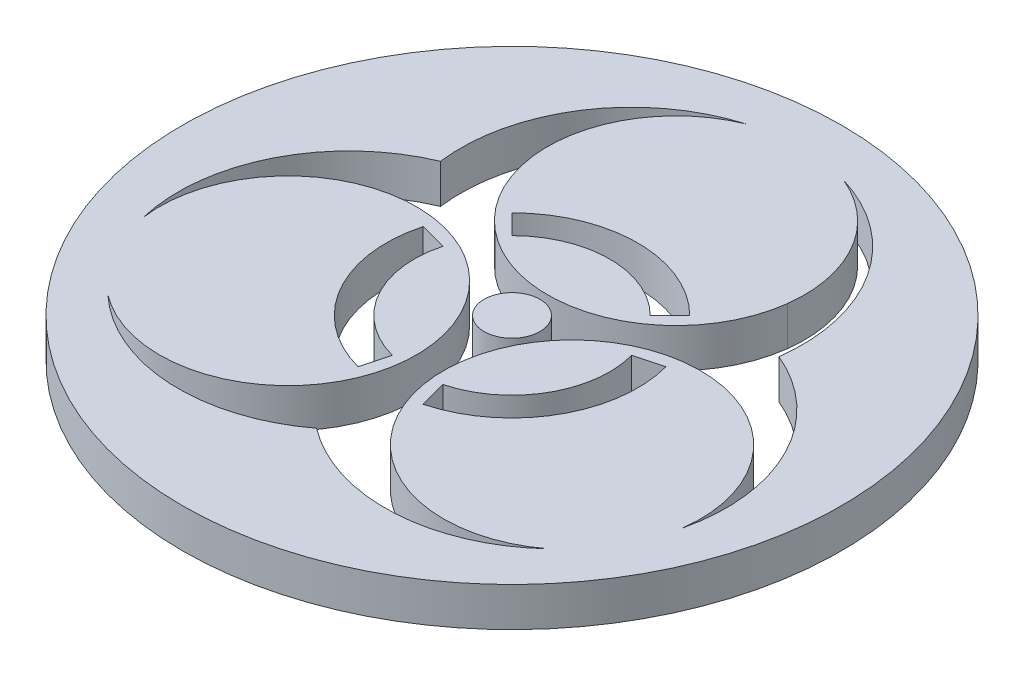
ISO-10303-21;
HEADER;
FILE_DESCRIPTION(('STEP AP214'),'2;1');
FILE_NAME('part.step','',(''),(''),'','','');
FILE_SCHEMA(('AUTOMOTIVE_DESIGN { 1 0 10303 214 1 1 1 1 }'));
ENDSEC;
DATA;
#1=APPLICATION_CONTEXT('core data for automotive mechanical design processes');
#2=APPLICATION_PROTOCOL_DEFINITION('international standard','automotive_design',2000,#1);
#3=PRODUCT_CONTEXT('',#1,'mechanical');
#4=PRODUCT('Part','Part','',(#3));
#5=PRODUCT_RELATED_PRODUCT_CATEGORY('part','',(#4));
#6=PRODUCT_DEFINITION_FORMATION('','',#4);
#7=PRODUCT_DEFINITION_CONTEXT('part definition',#1,'design');
#8=PRODUCT_DEFINITION('design','',#6,#7);
#9=PRODUCT_DEFINITION_SHAPE('','',#8);
#10=(LENGTH_UNIT() NAMED_UNIT(*) SI_UNIT(.MILLI.,.METRE.));
#11=(NAMED_UNIT(*) PLANE_ANGLE_UNIT() SI_UNIT($,.RADIAN.));
#12=(NAMED_UNIT(*) SI_UNIT($,.STERADIAN.) SOLID_ANGLE_UNIT());
#13=UNCERTAINTY_MEASURE_WITH_UNIT(LENGTH_MEASURE(1.E-05),#10,'distance_accuracy_value','');
#14=(GEOMETRIC_REPRESENTATION_CONTEXT(3) GLOBAL_UNCERTAINTY_ASSIGNED_CONTEXT((#13)) GLOBAL_UNIT_ASSIGNED_CONTEXT((#10,
#11,#12)) REPRESENTATION_CONTEXT('',''));
#15=CARTESIAN_POINT('',(0.,0.,0.));
#16=DIRECTION('',(0.,0.,1.));
#17=DIRECTION('',(1.,0.,0.));
#18=AXIS2_PLACEMENT_3D('',#15,#16,#17);
#19=CARTESIAN_POINT('',(0.,7.,0.));
#20=DIRECTION('',(0.,-1.,0.));
#21=DIRECTION('',(0.,0.,-1.));
#22=AXIS2_PLACEMENT_3D('',#19,#20,#21);
#23=CYLINDRICAL_SURFACE('',#22,5.);
#24=CARTESIAN_POINT('',(0.,7.,0.));
#25=DIRECTION('',(0.,1.,0.));
#26=DIRECTION('',(0.,0.,1.));
#27=AXIS2_PLACEMENT_3D('',#24,#25,#26);
#28=CIRCLE('',#27,5.);
#29=CARTESIAN_POINT('',(0.,7.,5.));
#30=VERTEX_POINT('',#29);
#31=EDGE_CURVE('E12',#30,#30,#28,.T.);
#32=ORIENTED_EDGE('',*,*,#31,.F.);
#33=EDGE_LOOP('',(#32));
#34=FACE_BOUND('',#33,.T.);
#35=CARTESIAN_POINT('',(0.,0.,0.));
#36=DIRECTION('',(0.,1.,0.));
#37=DIRECTION('',(0.,0.,1.));
#38=AXIS2_PLACEMENT_3D('',#35,#36,#37);
#39=CIRCLE('',#38,5.);
#40=CARTESIAN_POINT('',(0.,0.,5.));
#41=VERTEX_POINT('',#40);
#42=EDGE_CURVE('E60',#41,#41,#39,.T.);
#43=ORIENTED_EDGE('',*,*,#42,.T.);
#44=EDGE_LOOP('',(#43));
#45=FACE_BOUND('',#44,.T.);
#46=ADVANCED_FACE('F57',(#34,#45),#23,.T.);
#47=CARTESIAN_POINT('',(0.,7.,0.));
#48=DIRECTION('',(0.,1.,0.));
#49=DIRECTION('',(0.,0.,1.));
#50=AXIS2_PLACEMENT_3D('',#47,#48,#49);
#51=PLANE('',#50);
#52=ORIENTED_EDGE('',*,*,#31,.T.);
#53=EDGE_LOOP('',(#52));
#54=FACE_BOUND('',#53,.T.);
#55=ADVANCED_FACE('F72',(#54),#51,.T.);
#56=CARTESIAN_POINT('',(0.,0.,0.));
#57=DIRECTION('',(0.,1.,0.));
#58=DIRECTION('',(0.,0.,1.));
#59=AXIS2_PLACEMENT_3D('',#56,#57,#58);
#60=PLANE('',#59);
#61=ORIENTED_EDGE('',*,*,#42,.F.);
#62=EDGE_LOOP('',(#61));
#63=FACE_BOUND('',#62,.T.);
#64=ADVANCED_FACE('F70',(#63),#60,.F.);
#65=CLOSED_SHELL('',(#46,#55,#64));
#66=MANIFOLD_SOLID_BREP('B2',#65);
#67=CARTESIAN_POINT('',(0.,7.,0.));
#68=DIRECTION('',(0.,-1.,0.));
#69=DIRECTION('',(0.,0.,-1.));
#70=AXIS2_PLACEMENT_3D('',#67,#68,#69);
#71=CYLINDRICAL_SURFACE('',#70,17.5);
#72=CARTESIAN_POINT('',(0.,0.,0.));
#73=DIRECTION('',(0.,1.,0.));
#74=DIRECTION('',(0.,0.,1.));
#75=AXIS2_PLACEMENT_3D('',#72,#73,#74);
#76=CIRCLE('',#75,17.5);
#77=CARTESIAN_POINT('',(-12.3743686707646,0.,-12.3743686707646));
#78=VERTEX_POINT('',#77);
#79=CARTESIAN_POINT('',(12.3743686707646,0.,-12.3743686707646));
#80=VERTEX_POINT('',#79);
#81=EDGE_CURVE('E501',#78,#80,#76,.F.);
#82=ORIENTED_EDGE('',*,*,#81,.F.);
#83=DIRECTION('',(0.,-1.,0.));
#84=VECTOR('',#83,1.);
#85=CARTESIAN_POINT('',(-12.3743686707646,7.,-12.3743686707646));
#86=LINE('',#85,#84);
#87=CARTESIAN_POINT('',(-12.3743686707646,7.,-12.3743686707646));
#88=VERTEX_POINT('',#87);
#89=EDGE_CURVE('E55',#88,#78,#86,.T.);
#90=ORIENTED_EDGE('',*,*,#89,.F.);
#91=CARTESIAN_POINT('',(0.,7.,0.));
#92=DIRECTION('',(0.,1.,0.));
#93=DIRECTION('',(0.,0.,1.));
#94=AXIS2_PLACEMENT_3D('',#91,#92,#93);
#95=CIRCLE('',#94,17.5);
#96=CARTESIAN_POINT('',(12.3743686707646,7.,-12.3743686707646));
#97=VERTEX_POINT('',#96);
#98=EDGE_CURVE('E318',#88,#97,#95,.F.);
#99=ORIENTED_EDGE('',*,*,#98,.T.);
#100=DIRECTION('',(0.,-1.,0.));
#101=VECTOR('',#100,1.);
#102=CARTESIAN_POINT('',(12.3743686707646,7.,-12.3743686707646));
#103=LINE('',#102,#101);
#104=EDGE_CURVE('E221',#97,#80,#103,.T.);
#105=ORIENTED_EDGE('',*,*,#104,.T.);
#106=EDGE_LOOP('',(#82,#90,#99,#105));
#107=FACE_BOUND('',#106,.T.);
#108=ADVANCED_FACE('F107',(#107),#71,.T.);
#109=CARTESIAN_POINT('',(0.,7.,0.));
#110=DIRECTION('',(-0.707106781186547,0.,0.707106781186548));
#111=DIRECTION('',(0.707106781186548,0.,0.707106781186547));
#112=AXIS2_PLACEMENT_3D('',#109,#110,#111);
#113=PLANE('',#112);
#114=DIRECTION('',(-0.707106781186548,0.,-0.707106781186547));
#115=VECTOR('',#114,1.);
#116=CARTESIAN_POINT('',(0.,0.,0.));
#117=LINE('',#116,#115);
#118=CARTESIAN_POINT('',(-15.9099025766973,0.,-15.9099025766973));
#119=VERTEX_POINT('',#118);
#120=EDGE_CURVE('E324',#78,#119,#117,.T.);
#121=ORIENTED_EDGE('',*,*,#120,.T.);
#122=DIRECTION('',(0.,-1.,0.));
#123=VECTOR('',#122,1.);
#124=CARTESIAN_POINT('',(-15.9099025766973,7.,-15.9099025766973));
#125=LINE('',#124,#123);
#126=CARTESIAN_POINT('',(-15.9099025766973,7.,-15.9099025766973));
#127=VERTEX_POINT('',#126);
#128=EDGE_CURVE('E118',#127,#119,#125,.T.);
#129=ORIENTED_EDGE('',*,*,#128,.F.);
#130=DIRECTION('',(-0.707106781186548,0.,-0.707106781186547));
#131=VECTOR('',#130,1.);
#132=CARTESIAN_POINT('',(0.,7.,0.));
#133=LINE('',#132,#131);
#134=EDGE_CURVE('E313',#88,#127,#133,.T.);
#135=ORIENTED_EDGE('',*,*,#134,.F.);
#136=ORIENTED_EDGE('',*,*,#89,.T.);
#137=EDGE_LOOP('',(#121,#129,#135,#136));
#138=FACE_BOUND('',#137,.T.);
#139=ADVANCED_FACE('F322',(#138),#113,.F.);
#140=CARTESIAN_POINT('',(0.,7.,0.));
#141=DIRECTION('',(0.,-1.,0.));
#142=DIRECTION('',(0.,0.,-1.));
#143=AXIS2_PLACEMENT_3D('',#140,#141,#142);
#144=CYLINDRICAL_SURFACE('',#143,22.5);
#145=CARTESIAN_POINT('',(0.,0.,0.));
#146=DIRECTION('',(0.,1.,0.));
#147=DIRECTION('',(0.,0.,1.));
#148=AXIS2_PLACEMENT_3D('',#145,#146,#147);
#149=CIRCLE('',#148,22.5);
#150=CARTESIAN_POINT('',(15.9099025766974,0.,-15.9099025766973));
#151=VERTEX_POINT('',#150);
#152=EDGE_CURVE('E506',#119,#151,#149,.F.);
#153=ORIENTED_EDGE('',*,*,#152,.T.);
#154=DIRECTION('',(0.,-1.,0.));
#155=VECTOR('',#154,1.);
#156=CARTESIAN_POINT('',(15.9099025766974,7.,-15.9099025766973));
#157=LINE('',#156,#155);
#158=CARTESIAN_POINT('',(15.9099025766974,7.,-15.9099025766973));
#159=VERTEX_POINT('',#158);
#160=EDGE_CURVE('E311',#159,#151,#157,.T.);
#161=ORIENTED_EDGE('',*,*,#160,.F.);
#162=CARTESIAN_POINT('',(0.,7.,0.));
#163=DIRECTION('',(0.,1.,0.));
#164=DIRECTION('',(0.,0.,1.));
#165=AXIS2_PLACEMENT_3D('',#162,#163,#164);
#166=CIRCLE('',#165,22.5);
#167=EDGE_CURVE('E305',#127,#159,#166,.F.);
#168=ORIENTED_EDGE('',*,*,#167,.F.);
#169=ORIENTED_EDGE('',*,*,#128,.T.);
#170=EDGE_LOOP('',(#153,#161,#168,#169));
#171=FACE_BOUND('',#170,.T.);
#172=ADVANCED_FACE('F308',(#171),#144,.F.);
#173=CARTESIAN_POINT('',(0.,7.,-29.3723925144068));
#174=DIRECTION('',(0.,-1.,0.));
#175=DIRECTION('',(0.,0.,-1.));
#176=AXIS2_PLACEMENT_3D('',#173,#174,#175);
#177=CYLINDRICAL_SURFACE('',#176,23.0013165159468);
#178=CARTESIAN_POINT('',(0.,0.,-29.3723925144068));
#179=DIRECTION('',(0.,1.,0.));
#180=DIRECTION('',(0.,0.,1.));
#181=AXIS2_PLACEMENT_3D('',#178,#179,#180);
#182=CIRCLE('',#181,23.0013165159468);
#183=CARTESIAN_POINT('',(8.90555512712679,0.,-50.5797414610449));
#184=VERTEX_POINT('',#183);
#185=CARTESIAN_POINT('',(8.80222275323837,0.,-50.6228380643039));
#186=VERTEX_POINT('',#185);
#187=EDGE_CURVE('E452',#184,#186,#182,.T.);
#188=ORIENTED_EDGE('',*,*,#187,.T.);
#189=DIRECTION('',(0.,-1.,0.));
#190=VECTOR('',#189,1.);
#191=CARTESIAN_POINT('',(8.80222275323837,7.,-50.6228380643039));
#192=LINE('',#191,#190);
#193=CARTESIAN_POINT('',(8.80222275323837,7.,-50.6228380643039));
#194=VERTEX_POINT('',#193);
#195=EDGE_CURVE('E383',#194,#186,#192,.T.);
#196=ORIENTED_EDGE('',*,*,#195,.F.);
#197=CARTESIAN_POINT('',(0.,7.,-29.3723925144068));
#198=DIRECTION('',(0.,1.,0.));
#199=DIRECTION('',(0.,0.,1.));
#200=AXIS2_PLACEMENT_3D('',#197,#198,#199);
#201=CIRCLE('',#200,23.0013165159468);
#202=CARTESIAN_POINT('',(8.90555512712679,7.,-50.5797414610449));
#203=VERTEX_POINT('',#202);
#204=EDGE_CURVE('E547',#203,#194,#201,.T.);
#205=ORIENTED_EDGE('',*,*,#204,.F.);
#206=DIRECTION('',(0.,-1.,0.));
#207=VECTOR('',#206,1.);
#208=CARTESIAN_POINT('',(8.90555512712679,7.,-50.5797414610449));
#209=LINE('',#208,#207);
#210=EDGE_CURVE('E331',#203,#184,#209,.T.);
#211=ORIENTED_EDGE('',*,*,#210,.T.);
#212=EDGE_LOOP('',(#188,#196,#205,#211));
#213=FACE_BOUND('',#212,.T.);
#214=ADVANCED_FACE('F638',(#213),#177,.T.);
#215=CARTESIAN_POINT('',(0.,7.,-21.3723925144068));
#216=DIRECTION('',(0.,-1.,0.));
#217=DIRECTION('',(0.,0.,-1.));
#218=AXIS2_PLACEMENT_3D('',#215,#216,#217);
#219=CYLINDRICAL_SURFACE('',#218,30.5461567184011);
#220=CARTESIAN_POINT('',(0.,0.,-21.3723925144068));
#221=DIRECTION('',(0.,1.,0.));
#222=DIRECTION('',(0.,0.,1.));
#223=AXIS2_PLACEMENT_3D('',#220,#221,#222);
#224=CIRCLE('',#223,30.5461567184011);
#225=CARTESIAN_POINT('',(30.3037742314015,0.,-17.5319553521337));
#226=VERTEX_POINT('',#225);
#227=EDGE_CURVE('E456',#186,#226,#224,.F.);
#228=ORIENTED_EDGE('',*,*,#227,.T.);
#229=DIRECTION('',(0.,-1.,0.));
#230=VECTOR('',#229,1.);
#231=CARTESIAN_POINT('',(30.3037742314015,7.,-17.5319553521337));
#232=LINE('',#231,#230);
#233=CARTESIAN_POINT('',(30.3037742314015,7.,-17.5319553521337));
#234=VERTEX_POINT('',#233);
#235=EDGE_CURVE('E379',#234,#226,#232,.T.);
#236=ORIENTED_EDGE('',*,*,#235,.F.);
#237=CARTESIAN_POINT('',(0.,7.,-21.3723925144068));
#238=DIRECTION('',(0.,1.,0.));
#239=DIRECTION('',(0.,0.,1.));
#240=AXIS2_PLACEMENT_3D('',#237,#238,#239);
#241=CIRCLE('',#240,30.5461567184011);
#242=EDGE_CURVE('E551',#194,#234,#241,.F.);
#243=ORIENTED_EDGE('',*,*,#242,.F.);
#244=ORIENTED_EDGE('',*,*,#195,.T.);
#245=EDGE_LOOP('',(#228,#236,#243,#244));
#246=FACE_BOUND('',#245,.T.);
#247=ADVANCED_FACE('F672',(#246),#219,.F.);
#248=CARTESIAN_POINT('',(0.,7.,-21.3619599600162));
#249=DIRECTION('',(0.,-1.,0.));
#250=DIRECTION('',(0.,0.,-1.));
#251=AXIS2_PLACEMENT_3D('',#248,#249,#250);
#252=CYLINDRICAL_SURFACE('',#251,30.5448468315713);
#253=CARTESIAN_POINT('',(0.,0.,-21.3619599600162));
#254=DIRECTION('',(0.,1.,0.));
#255=DIRECTION('',(0.,0.,1.));
#256=AXIS2_PLACEMENT_3D('',#253,#254,#255);
#257=CIRCLE('',#256,30.5448468315713);
#258=CARTESIAN_POINT('',(30.2988301568784,0.,-17.4930377472045));
#259=VERTEX_POINT('',#258);
#260=EDGE_CURVE('E461',#226,#259,#257,.F.);
#261=ORIENTED_EDGE('',*,*,#260,.T.);
#262=DIRECTION('',(0.,-1.,0.));
#263=VECTOR('',#262,1.);
#264=CARTESIAN_POINT('',(30.2988301568784,7.,-17.4930377472045));
#265=LINE('',#264,#263);
#266=CARTESIAN_POINT('',(30.2988301568784,7.,-17.4930377472045));
#267=VERTEX_POINT('',#266);
#268=EDGE_CURVE('E376',#267,#259,#265,.T.);
#269=ORIENTED_EDGE('',*,*,#268,.F.);
#270=CARTESIAN_POINT('',(0.,7.,-21.3619599600162));
#271=DIRECTION('',(0.,1.,0.));
#272=DIRECTION('',(0.,0.,1.));
#273=AXIS2_PLACEMENT_3D('',#270,#271,#272);
#274=CIRCLE('',#273,30.5448468315713);
#275=EDGE_CURVE('E556',#234,#267,#274,.F.);
#276=ORIENTED_EDGE('',*,*,#275,.F.);
#277=ORIENTED_EDGE('',*,*,#235,.T.);
#278=EDGE_LOOP('',(#261,#269,#276,#277));
#279=FACE_BOUND('',#278,.T.);
#280=ADVANCED_FACE('F627',(#279),#252,.F.);
#281=CARTESIAN_POINT('',(18.5,7.,10.6809799800081));
#282=DIRECTION('',(0.,-1.,0.));
#283=DIRECTION('',(0.,0.,-1.));
#284=AXIS2_PLACEMENT_3D('',#281,#282,#283);
#285=CYLINDRICAL_SURFACE('',#284,30.5448468315713);
#286=CARTESIAN_POINT('',(18.5,0.,10.6809799800081));
#287=DIRECTION('',(0.,1.,0.));
#288=DIRECTION('',(0.,0.,1.));
#289=AXIS2_PLACEMENT_3D('',#286,#287,#288);
#290=CIRCLE('',#289,30.5448468315713);
#291=CARTESIAN_POINT('',(48.2314350418731,0.,17.6830824010692));
#292=VERTEX_POINT('',#291);
#293=EDGE_CURVE('E465',#292,#259,#290,.T.);
#294=ORIENTED_EDGE('',*,*,#293,.F.);
#295=DIRECTION('',(0.,-1.,0.));
#296=VECTOR('',#295,1.);
#297=CARTESIAN_POINT('',(48.2314350418731,7.,17.6830824010692));
#298=LINE('',#297,#296);
#299=CARTESIAN_POINT('',(48.2314350418731,7.,17.6830824010692));
#300=VERTEX_POINT('',#299);
#301=EDGE_CURVE('E373',#300,#292,#298,.T.);
#302=ORIENTED_EDGE('',*,*,#301,.F.);
#303=CARTESIAN_POINT('',(18.5,7.,10.6809799800081));
#304=DIRECTION('',(0.,1.,0.));
#305=DIRECTION('',(0.,0.,1.));
#306=AXIS2_PLACEMENT_3D('',#303,#304,#305);
#307=CIRCLE('',#306,30.5448468315713);
#308=EDGE_CURVE('E559',#300,#267,#307,.T.);
#309=ORIENTED_EDGE('',*,*,#308,.T.);
#310=ORIENTED_EDGE('',*,*,#268,.T.);
#311=EDGE_LOOP('',(#294,#302,#309,#310));
#312=FACE_BOUND('',#311,.T.);
#313=ADVANCED_FACE('F667',(#312),#285,.F.);
#314=CARTESIAN_POINT('',(25.4282032302755,7.,14.6809799800081));
#315=DIRECTION('',(0.,-1.,0.));
#316=DIRECTION('',(0.,0.,-1.));
#317=AXIS2_PLACEMENT_3D('',#314,#315,#316);
#318=CYLINDRICAL_SURFACE('',#317,23.);
#319=CARTESIAN_POINT('',(25.4282032302755,0.,14.6809799800081));
#320=DIRECTION('',(0.,1.,0.));
#321=DIRECTION('',(0.,0.,1.));
#322=AXIS2_PLACEMENT_3D('',#319,#320,#321);
#323=CIRCLE('',#322,23.);
#324=CARTESIAN_POINT('',(39.4297160974761,0.,32.9281068067065));
#325=VERTEX_POINT('',#324);
#326=EDGE_CURVE('E470',#292,#325,#323,.T.);
#327=ORIENTED_EDGE('',*,*,#326,.T.);
#328=DIRECTION('',(0.,-1.,0.));
#329=VECTOR('',#328,1.);
#330=CARTESIAN_POINT('',(39.4297160974761,7.,32.9281068067065));
#331=LINE('',#330,#329);
#332=CARTESIAN_POINT('',(39.4297160974761,7.,32.9281068067065));
#333=VERTEX_POINT('',#332);
#334=EDGE_CURVE('E370',#333,#325,#331,.T.);
#335=ORIENTED_EDGE('',*,*,#334,.F.);
#336=CARTESIAN_POINT('',(25.4282032302755,7.,14.6809799800081));
#337=DIRECTION('',(0.,1.,0.));
#338=DIRECTION('',(0.,0.,1.));
#339=AXIS2_PLACEMENT_3D('',#336,#337,#338);
#340=CIRCLE('',#339,23.);
#341=EDGE_CURVE('E564',#300,#333,#340,.T.);
#342=ORIENTED_EDGE('',*,*,#341,.F.);
#343=ORIENTED_EDGE('',*,*,#301,.T.);
#344=EDGE_LOOP('',(#327,#335,#342,#343));
#345=FACE_BOUND('',#344,.T.);
#346=ADVANCED_FACE('F663',(#345),#318,.T.);
#347=CARTESIAN_POINT('',(18.5,7.,10.6809799800081));
#348=DIRECTION('',(0.,-1.,0.));
#349=DIRECTION('',(0.,0.,-1.));
#350=AXIS2_PLACEMENT_3D('',#347,#348,#349);
#351=CYLINDRICAL_SURFACE('',#350,30.5448468315713);
#352=CARTESIAN_POINT('',(18.5,0.,10.6809799800081));
#353=DIRECTION('',(0.,1.,0.));
#354=DIRECTION('',(0.,0.,1.));
#355=AXIS2_PLACEMENT_3D('',#352,#353,#354);
#356=CIRCLE('',#355,30.5448468315713);
#357=CARTESIAN_POINT('',(0.,0.,34.986075494409));
#358=VERTEX_POINT('',#357);
#359=EDGE_CURVE('E474',#358,#325,#356,.T.);
#360=ORIENTED_EDGE('',*,*,#359,.F.);
#361=DIRECTION('',(0.,-1.,0.));
#362=VECTOR('',#361,1.);
#363=CARTESIAN_POINT('',(0.,7.,34.986075494409));
#364=LINE('',#363,#362);
#365=CARTESIAN_POINT('',(0.,7.,34.986075494409));
#366=VERTEX_POINT('',#365);
#367=EDGE_CURVE('E367',#366,#358,#364,.T.);
#368=ORIENTED_EDGE('',*,*,#367,.F.);
#369=CARTESIAN_POINT('',(18.5,7.,10.6809799800081));
#370=DIRECTION('',(0.,1.,0.));
#371=DIRECTION('',(0.,0.,1.));
#372=AXIS2_PLACEMENT_3D('',#369,#370,#371);
#373=CIRCLE('',#372,30.5448468315713);
#374=EDGE_CURVE('E567',#366,#333,#373,.T.);
#375=ORIENTED_EDGE('',*,*,#374,.T.);
#376=ORIENTED_EDGE('',*,*,#334,.T.);
#377=EDGE_LOOP('',(#360,#368,#375,#376));
#378=FACE_BOUND('',#377,.T.);
#379=ADVANCED_FACE('F659',(#378),#351,.F.);
#380=CARTESIAN_POINT('',(-18.5,7.,10.6809799800081));
#381=DIRECTION('',(0.,-1.,0.));
#382=DIRECTION('',(0.,0.,-1.));
#383=AXIS2_PLACEMENT_3D('',#380,#381,#382);
#384=CYLINDRICAL_SURFACE('',#383,30.5448468315713);
#385=CARTESIAN_POINT('',(-18.5,0.,10.6809799800081));
#386=DIRECTION('',(0.,1.,0.));
#387=DIRECTION('',(0.,0.,1.));
#388=AXIS2_PLACEMENT_3D('',#385,#386,#387);
#389=CIRCLE('',#388,30.5448468315713);
#390=CARTESIAN_POINT('',(-39.4297160974761,0.,32.9281068067065));
#391=VERTEX_POINT('',#390);
#392=EDGE_CURVE('E478',#358,#391,#389,.F.);
#393=ORIENTED_EDGE('',*,*,#392,.T.);
#394=DIRECTION('',(0.,-1.,0.));
#395=VECTOR('',#394,1.);
#396=CARTESIAN_POINT('',(-39.4297160974761,7.,32.9281068067065));
#397=LINE('',#396,#395);
#398=CARTESIAN_POINT('',(-39.4297160974761,7.,32.9281068067065));
#399=VERTEX_POINT('',#398);
#400=EDGE_CURVE('E363',#399,#391,#397,.T.);
#401=ORIENTED_EDGE('',*,*,#400,.F.);
#402=CARTESIAN_POINT('',(-18.5,7.,10.6809799800081));
#403=DIRECTION('',(0.,1.,0.));
#404=DIRECTION('',(0.,0.,1.));
#405=AXIS2_PLACEMENT_3D('',#402,#403,#404);
#406=CIRCLE('',#405,30.5448468315713);
#407=EDGE_CURVE('E571',#366,#399,#406,.F.);
#408=ORIENTED_EDGE('',*,*,#407,.F.);
#409=ORIENTED_EDGE('',*,*,#367,.T.);
#410=EDGE_LOOP('',(#393,#401,#408,#409));
#411=FACE_BOUND('',#410,.T.);
#412=ADVANCED_FACE('F655',(#411),#384,.F.);
#413=CARTESIAN_POINT('',(-25.4282032302755,7.,14.6809799800081));
#414=DIRECTION('',(0.,-1.,0.));
#415=DIRECTION('',(0.,0.,-1.));
#416=AXIS2_PLACEMENT_3D('',#413,#414,#415);
#417=CYLINDRICAL_SURFACE('',#416,23.);
#418=CARTESIAN_POINT('',(-25.4282032302755,0.,14.6809799800081));
#419=DIRECTION('',(0.,1.,0.));
#420=DIRECTION('',(0.,0.,1.));
#421=AXIS2_PLACEMENT_3D('',#418,#419,#420);
#422=CIRCLE('',#421,23.);
#423=CARTESIAN_POINT('',(-48.2314350418731,0.,17.6830824010692));
#424=VERTEX_POINT('',#423);
#425=EDGE_CURVE('E481',#391,#424,#422,.T.);
#426=ORIENTED_EDGE('',*,*,#425,.T.);
#427=DIRECTION('',(0.,-1.,0.));
#428=VECTOR('',#427,1.);
#429=CARTESIAN_POINT('',(-48.2314350418731,7.,17.6830824010692));
#430=LINE('',#429,#428);
#431=CARTESIAN_POINT('',(-48.2314350418731,7.,17.6830824010692));
#432=VERTEX_POINT('',#431);
#433=EDGE_CURVE('E360',#432,#424,#430,.T.);
#434=ORIENTED_EDGE('',*,*,#433,.F.);
#435=CARTESIAN_POINT('',(-25.4282032302755,7.,14.6809799800081));
#436=DIRECTION('',(0.,1.,0.));
#437=DIRECTION('',(0.,0.,1.));
#438=AXIS2_PLACEMENT_3D('',#435,#436,#437);
#439=CIRCLE('',#438,23.);
#440=EDGE_CURVE('E574',#399,#432,#439,.T.);
#441=ORIENTED_EDGE('',*,*,#440,.F.);
#442=ORIENTED_EDGE('',*,*,#400,.T.);
#443=EDGE_LOOP('',(#426,#434,#441,#442));
#444=FACE_BOUND('',#443,.T.);
#445=ADVANCED_FACE('F651',(#444),#417,.T.);
#446=CARTESIAN_POINT('',(-18.5,7.,10.6809799800081));
#447=DIRECTION('',(0.,-1.,0.));
#448=DIRECTION('',(0.,0.,-1.));
#449=AXIS2_PLACEMENT_3D('',#446,#447,#448);
#450=CYLINDRICAL_SURFACE('',#449,30.5448468315714);
#451=CARTESIAN_POINT('',(-18.5,0.,10.6809799800081));
#452=DIRECTION('',(0.,1.,0.));
#453=DIRECTION('',(0.,0.,1.));
#454=AXIS2_PLACEMENT_3D('',#451,#452,#453);
#455=CIRCLE('',#454,30.5448468315714);
#456=CARTESIAN_POINT('',(-30.2988301568784,0.,-17.4930377472045));
#457=VERTEX_POINT('',#456);
#458=EDGE_CURVE('E485',#457,#424,#455,.T.);
#459=ORIENTED_EDGE('',*,*,#458,.F.);
#460=DIRECTION('',(0.,-1.,0.));
#461=VECTOR('',#460,1.);
#462=CARTESIAN_POINT('',(-30.2988301568784,7.,-17.4930377472045));
#463=LINE('',#462,#461);
#464=CARTESIAN_POINT('',(-30.2988301568784,7.,-17.4930377472045));
#465=VERTEX_POINT('',#464);
#466=EDGE_CURVE('E357',#465,#457,#463,.T.);
#467=ORIENTED_EDGE('',*,*,#466,.F.);
#468=CARTESIAN_POINT('',(-18.5,7.,10.6809799800081));
#469=DIRECTION('',(0.,1.,0.));
#470=DIRECTION('',(0.,0.,1.));
#471=AXIS2_PLACEMENT_3D('',#468,#469,#470);
#472=CIRCLE('',#471,30.5448468315714);
#473=EDGE_CURVE('E577',#465,#432,#472,.T.);
#474=ORIENTED_EDGE('',*,*,#473,.T.);
#475=ORIENTED_EDGE('',*,*,#433,.T.);
#476=EDGE_LOOP('',(#459,#467,#474,#475));
#477=FACE_BOUND('',#476,.T.);
#478=ADVANCED_FACE('F647',(#477),#450,.F.);
#479=CARTESIAN_POINT('',(0.,7.,-21.3723925144068));
#480=DIRECTION('',(0.,-1.,0.));
#481=DIRECTION('',(0.,0.,-1.));
#482=AXIS2_PLACEMENT_3D('',#479,#480,#481);
#483=CYLINDRICAL_SURFACE('',#482,30.5461700100877);
#484=CARTESIAN_POINT('',(0.,0.,-21.3723925144068));
#485=DIRECTION('',(0.,1.,0.));
#486=DIRECTION('',(0.,0.,1.));
#487=AXIS2_PLACEMENT_3D('',#484,#485,#486);
#488=CIRCLE('',#487,30.5461700100877);
#489=CARTESIAN_POINT('',(-8.80210022787439,0.,-50.6228888155575));
#490=VERTEX_POINT('',#489);
#491=EDGE_CURVE('E489',#490,#457,#488,.T.);
#492=ORIENTED_EDGE('',*,*,#491,.F.);
#493=DIRECTION('',(0.,-1.,0.));
#494=VECTOR('',#493,1.);
#495=CARTESIAN_POINT('',(-8.80210022787439,7.,-50.6228888155575));
#496=LINE('',#495,#494);
#497=CARTESIAN_POINT('',(-8.80210022787439,7.,-50.6228888155575));
#498=VERTEX_POINT('',#497);
#499=EDGE_CURVE('E354',#498,#490,#496,.T.);
#500=ORIENTED_EDGE('',*,*,#499,.F.);
#501=CARTESIAN_POINT('',(0.,7.,-21.3723925144068));
#502=DIRECTION('',(0.,1.,0.));
#503=DIRECTION('',(0.,0.,1.));
#504=AXIS2_PLACEMENT_3D('',#501,#502,#503);
#505=CIRCLE('',#504,30.5461700100877);
#506=EDGE_CURVE('E581',#498,#465,#505,.T.);
#507=ORIENTED_EDGE('',*,*,#506,.T.);
#508=ORIENTED_EDGE('',*,*,#466,.T.);
#509=EDGE_LOOP('',(#492,#500,#507,#508));
#510=FACE_BOUND('',#509,.T.);
#511=ADVANCED_FACE('F644',(#510),#483,.F.);
#512=CARTESIAN_POINT('',(-8.90555512712679,0.,-50.5797414610449));
#513=VERTEX_POINT('',#512);
#514=EDGE_CURVE('E458',#490,#513,#182,.T.);
#515=ORIENTED_EDGE('',*,*,#514,.T.);
#516=DIRECTION('',(0.,-1.,0.));
#517=VECTOR('',#516,1.);
#518=CARTESIAN_POINT('',(-8.90555512712679,7.,-50.5797414610449));
#519=LINE('',#518,#517);
#520=CARTESIAN_POINT('',(-8.90555512712679,7.,-50.5797414610449));
#521=VERTEX_POINT('',#520);
#522=EDGE_CURVE('E351',#521,#513,#519,.T.);
#523=ORIENTED_EDGE('',*,*,#522,.F.);
#524=EDGE_CURVE('E553',#498,#521,#201,.T.);
#525=ORIENTED_EDGE('',*,*,#524,.F.);
#526=ORIENTED_EDGE('',*,*,#499,.T.);
#527=EDGE_LOOP('',(#515,#523,#525,#526));
#528=FACE_BOUND('',#527,.T.);
#529=ADVANCED_FACE('F639',(#528),#177,.T.);
#530=CARTESIAN_POINT('',(0.,7.,-21.3619599600162));
#531=DIRECTION('',(0.,-1.,0.));
#532=DIRECTION('',(0.,0.,-1.));
#533=AXIS2_PLACEMENT_3D('',#530,#531,#532);
#534=CYLINDRICAL_SURFACE('',#533,30.5448468315713);
#535=CARTESIAN_POINT('',(0.,0.,-21.3619599600162));
#536=DIRECTION('',(0.,1.,0.));
#537=DIRECTION('',(0.,0.,1.));
#538=AXIS2_PLACEMENT_3D('',#535,#536,#537);
#539=CIRCLE('',#538,30.5448468315713);
#540=CARTESIAN_POINT('',(-8.80171894439707,0.,-50.6111892077758));
#541=VERTEX_POINT('',#540);
#542=EDGE_CURVE('E493',#541,#513,#539,.T.);
#543=ORIENTED_EDGE('',*,*,#542,.F.);
#544=DIRECTION('',(0.,-1.,0.));
#545=VECTOR('',#544,1.);
#546=CARTESIAN_POINT('',(-8.80171894439707,7.,-50.6111892077758));
#547=LINE('',#546,#545);
#548=CARTESIAN_POINT('',(-8.80171894439707,7.,-50.6111892077758));
#549=VERTEX_POINT('',#548);
#550=EDGE_CURVE('E348',#549,#541,#547,.T.);
#551=ORIENTED_EDGE('',*,*,#550,.F.);
#552=CARTESIAN_POINT('',(0.,7.,-21.3619599600162));
#553=DIRECTION('',(0.,1.,0.));
#554=DIRECTION('',(0.,0.,1.));
#555=AXIS2_PLACEMENT_3D('',#552,#553,#554);
#556=CIRCLE('',#555,30.5448468315713);
#557=EDGE_CURVE('E585',#549,#521,#556,.T.);
#558=ORIENTED_EDGE('',*,*,#557,.T.);
#559=ORIENTED_EDGE('',*,*,#522,.T.);
#560=EDGE_LOOP('',(#543,#551,#558,#559));
#561=FACE_BOUND('',#560,.T.);
#562=ADVANCED_FACE('F640',(#561),#534,.F.);
#563=CARTESIAN_POINT('',(0.,7.,-29.3619599600162));
#564=DIRECTION('',(0.,-1.,0.));
#565=DIRECTION('',(0.,0.,-1.));
#566=AXIS2_PLACEMENT_3D('',#563,#564,#565);
#567=CYLINDRICAL_SURFACE('',#566,23.);
#568=CARTESIAN_POINT('',(0.,0.,-29.3619599600162));
#569=DIRECTION('',(0.,1.,0.));
#570=DIRECTION('',(0.,0.,1.));
#571=AXIS2_PLACEMENT_3D('',#568,#569,#570);
#572=CIRCLE('',#571,23.);
#573=CARTESIAN_POINT('',(-22.8167835453758,0.,-26.4646528234723));
#574=VERTEX_POINT('',#573);
#575=EDGE_CURVE('E497',#541,#574,#572,.T.);
#576=ORIENTED_EDGE('',*,*,#575,.T.);
#577=DIRECTION('',(0.,-1.,0.));
#578=VECTOR('',#577,1.);
#579=CARTESIAN_POINT('',(-22.8167835453758,7.,-26.4646528234723));
#580=LINE('',#579,#578);
#581=CARTESIAN_POINT('',(-22.8167835453758,7.,-26.4646528234723));
#582=VERTEX_POINT('',#581);
#583=EDGE_CURVE('E344',#582,#574,#580,.T.);
#584=ORIENTED_EDGE('',*,*,#583,.F.);
#585=CARTESIAN_POINT('',(0.,7.,-29.3619599600162));
#586=DIRECTION('',(0.,1.,0.));
#587=DIRECTION('',(0.,0.,1.));
#588=AXIS2_PLACEMENT_3D('',#585,#586,#587);
#589=CIRCLE('',#588,23.);
#590=EDGE_CURVE('E589',#549,#582,#589,.T.);
#591=ORIENTED_EDGE('',*,*,#590,.F.);
#592=ORIENTED_EDGE('',*,*,#550,.T.);
#593=EDGE_LOOP('',(#576,#584,#591,#592));
#594=FACE_BOUND('',#593,.T.);
#595=ADVANCED_FACE('F634',(#594),#567,.T.);
#596=CARTESIAN_POINT('',(22.8167835453758,0.,-26.4646528234723));
#597=VERTEX_POINT('',#596);
#598=EDGE_CURVE('E457',#574,#597,#182,.T.);
#599=ORIENTED_EDGE('',*,*,#598,.T.);
#600=DIRECTION('',(0.,-1.,0.));
#601=VECTOR('',#600,1.);
#602=CARTESIAN_POINT('',(22.8167835453758,7.,-26.4646528234723));
#603=LINE('',#602,#601);
#604=CARTESIAN_POINT('',(22.8167835453758,7.,-26.4646528234723));
#605=VERTEX_POINT('',#604);
#606=EDGE_CURVE('E340',#605,#597,#603,.T.);
#607=ORIENTED_EDGE('',*,*,#606,.F.);
#608=EDGE_CURVE('E552',#582,#605,#201,.T.);
#609=ORIENTED_EDGE('',*,*,#608,.F.);
#610=ORIENTED_EDGE('',*,*,#583,.T.);
#611=EDGE_LOOP('',(#599,#607,#609,#610));
#612=FACE_BOUND('',#611,.T.);
#613=ADVANCED_FACE('F632',(#612),#177,.T.);
#614=CARTESIAN_POINT('',(8.80171894439708,0.,-50.6111892077758));
#615=VERTEX_POINT('',#614);
#616=EDGE_CURVE('E500',#597,#615,#572,.T.);
#617=ORIENTED_EDGE('',*,*,#616,.T.);
#618=DIRECTION('',(0.,-1.,0.));
#619=VECTOR('',#618,1.);
#620=CARTESIAN_POINT('',(8.80171894439708,7.,-50.6111892077758));
#621=LINE('',#620,#619);
#622=CARTESIAN_POINT('',(8.80171894439708,7.,-50.6111892077758));
#623=VERTEX_POINT('',#622);
#624=EDGE_CURVE('E335',#623,#615,#621,.T.);
#625=ORIENTED_EDGE('',*,*,#624,.F.);
#626=EDGE_CURVE('E592',#605,#623,#589,.T.);
#627=ORIENTED_EDGE('',*,*,#626,.F.);
#628=ORIENTED_EDGE('',*,*,#606,.T.);
#629=EDGE_LOOP('',(#617,#625,#627,#628));
#630=FACE_BOUND('',#629,.T.);
#631=ADVANCED_FACE('F628',(#630),#567,.T.);
#632=CARTESIAN_POINT('',(0.,7.,0.));
#633=DIRECTION('',(0.258819045102521,0.,0.965925826289068));
#634=DIRECTION('',(0.965925826289068,0.,-0.258819045102521));
#635=AXIS2_PLACEMENT_3D('',#632,#633,#634);
#636=PLANE('',#635);
#637=DIRECTION('',(-0.965925826289068,0.,0.258819045102521));
#638=VECTOR('',#637,1.);
#639=CARTESIAN_POINT('',(0.,0.,0.));
#640=LINE('',#639,#638);
#641=CARTESIAN_POINT('',(21.7333310915041,0.,-5.82342851480677));
#642=VERTEX_POINT('',#641);
#643=CARTESIAN_POINT('',(16.9037019600587,0.,-4.52933328929413));
#644=VERTEX_POINT('',#643);
#645=EDGE_CURVE('E436',#642,#644,#640,.T.);
#646=ORIENTED_EDGE('',*,*,#645,.F.);
#647=DIRECTION('',(0.,-1.,0.));
#648=VECTOR('',#647,1.);
#649=CARTESIAN_POINT('',(21.7333310915041,7.,-5.82342851480677));
#650=LINE('',#649,#648);
#651=CARTESIAN_POINT('',(21.7333310915041,7.,-5.82342851480677));
#652=VERTEX_POINT('',#651);
#653=EDGE_CURVE('E336',#652,#642,#650,.T.);
#654=ORIENTED_EDGE('',*,*,#653,.F.);
#655=DIRECTION('',(-0.965925826289068,0.,0.258819045102521));
#656=VECTOR('',#655,1.);
#657=CARTESIAN_POINT('',(0.,7.,0.));
#658=LINE('',#657,#656);
#659=CARTESIAN_POINT('',(16.9037019600587,7.,-4.52933328929413));
#660=VERTEX_POINT('',#659);
#661=EDGE_CURVE('E532',#652,#660,#658,.T.);
#662=ORIENTED_EDGE('',*,*,#661,.T.);
#663=DIRECTION('',(0.,-1.,0.));
#664=VECTOR('',#663,1.);
#665=CARTESIAN_POINT('',(16.9037019600587,7.,-4.52933328929413));
#666=LINE('',#665,#664);
#667=EDGE_CURVE('E387',#660,#644,#666,.T.);
#668=ORIENTED_EDGE('',*,*,#667,.T.);
#669=EDGE_LOOP('',(#646,#654,#662,#668));
#670=FACE_BOUND('',#669,.T.);
#671=ADVANCED_FACE('F631',(#670),#636,.T.);
#672=CARTESIAN_POINT('',(0.,7.,0.));
#673=DIRECTION('',(0.,-1.,0.));
#674=DIRECTION('',(0.,0.,-1.));
#675=AXIS2_PLACEMENT_3D('',#672,#673,#674);
#676=CYLINDRICAL_SURFACE('',#675,22.5000000000001);
#677=CARTESIAN_POINT('',(0.,0.,0.));
#678=DIRECTION('',(0.,1.,0.));
#679=DIRECTION('',(0.,0.,1.));
#680=AXIS2_PLACEMENT_3D('',#677,#678,#679);
#681=CIRCLE('',#680,22.5000000000001);
#682=CARTESIAN_POINT('',(5.82342851480669,0.,21.7333310915042));
#683=VERTEX_POINT('',#682);
#684=EDGE_CURVE('E440',#642,#683,#681,.F.);
#685=ORIENTED_EDGE('',*,*,#684,.T.);
#686=DIRECTION('',(0.,-1.,0.));
#687=VECTOR('',#686,1.);
#688=CARTESIAN_POINT('',(5.82342851480669,7.,21.7333310915042));
#689=LINE('',#688,#687);
#690=CARTESIAN_POINT('',(5.82342851480669,7.,21.7333310915042));
#691=VERTEX_POINT('',#690);
#692=EDGE_CURVE('E393',#691,#683,#689,.T.);
#693=ORIENTED_EDGE('',*,*,#692,.F.);
#694=CARTESIAN_POINT('',(0.,7.,0.));
#695=DIRECTION('',(0.,1.,0.));
#696=DIRECTION('',(0.,0.,1.));
#697=AXIS2_PLACEMENT_3D('',#694,#695,#696);
#698=CIRCLE('',#697,22.5000000000001);
#699=EDGE_CURVE('E536',#652,#691,#698,.F.);
#700=ORIENTED_EDGE('',*,*,#699,.F.);
#701=ORIENTED_EDGE('',*,*,#653,.T.);
#702=EDGE_LOOP('',(#685,#693,#700,#701));
#703=FACE_BOUND('',#702,.T.);
#704=ADVANCED_FACE('F682',(#703),#676,.F.);
#705=CARTESIAN_POINT('',(0.,7.,0.));
#706=DIRECTION('',(0.965925826289069,0.,-0.25881904510252));
#707=DIRECTION('',(-0.25881904510252,0.,-0.965925826289069));
#708=AXIS2_PLACEMENT_3D('',#705,#706,#707);
#709=PLANE('',#708);
#710=DIRECTION('',(0.25881904510252,0.,0.965925826289069));
#711=VECTOR('',#710,1.);
#712=CARTESIAN_POINT('',(0.,0.,0.));
#713=LINE('',#712,#711);
#714=CARTESIAN_POINT('',(4.52933328929407,0.,16.9037019600587));
#715=VERTEX_POINT('',#714);
#716=EDGE_CURVE('E444',#715,#683,#713,.T.);
#717=ORIENTED_EDGE('',*,*,#716,.F.);
#718=DIRECTION('',(0.,-1.,0.));
#719=VECTOR('',#718,1.);
#720=CARTESIAN_POINT('',(4.52933328929407,7.,16.9037019600587));
#721=LINE('',#720,#719);
#722=CARTESIAN_POINT('',(4.52933328929407,7.,16.9037019600587));
#723=VERTEX_POINT('',#722);
#724=EDGE_CURVE('E390',#723,#715,#721,.T.);
#725=ORIENTED_EDGE('',*,*,#724,.F.);
#726=DIRECTION('',(0.25881904510252,0.,0.965925826289069));
#727=VECTOR('',#726,1.);
#728=CARTESIAN_POINT('',(0.,7.,0.));
#729=LINE('',#728,#727);
#730=EDGE_CURVE('E539',#723,#691,#729,.T.);
#731=ORIENTED_EDGE('',*,*,#730,.T.);
#732=ORIENTED_EDGE('',*,*,#692,.T.);
#733=EDGE_LOOP('',(#717,#725,#731,#732));
#734=FACE_BOUND('',#733,.T.);
#735=ADVANCED_FACE('F679',(#734),#709,.T.);
#736=CARTESIAN_POINT('',(0.,7.,0.));
#737=DIRECTION('',(0.965925826289069,0.,0.258819045102518));
#738=DIRECTION('',(0.258819045102518,0.,-0.965925826289069));
#739=AXIS2_PLACEMENT_3D('',#736,#737,#738);
#740=PLANE('',#739);
#741=DIRECTION('',(-0.258819045102518,0.,0.965925826289069));
#742=VECTOR('',#741,1.);
#743=CARTESIAN_POINT('',(0.,0.,0.));
#744=LINE('',#743,#742);
#745=CARTESIAN_POINT('',(-4.52933328929407,0.,16.9037019600587));
#746=VERTEX_POINT('',#745);
#747=CARTESIAN_POINT('',(-5.82342851480666,0.,21.7333310915041));
#748=VERTEX_POINT('',#747);
#749=EDGE_CURVE('E419',#746,#748,#744,.T.);
#750=ORIENTED_EDGE('',*,*,#749,.T.);
#751=DIRECTION('',(0.,-1.,0.));
#752=VECTOR('',#751,1.);
#753=CARTESIAN_POINT('',(-5.82342851480666,7.,21.7333310915041));
#754=LINE('',#753,#752);
#755=CARTESIAN_POINT('',(-5.82342851480666,7.,21.7333310915041));
#756=VERTEX_POINT('',#755);
#757=EDGE_CURVE('E111',#756,#748,#754,.T.);
#758=ORIENTED_EDGE('',*,*,#757,.F.);
#759=DIRECTION('',(-0.258819045102518,0.,0.965925826289069));
#760=VECTOR('',#759,1.);
#761=CARTESIAN_POINT('',(0.,7.,0.));
#762=LINE('',#761,#760);
#763=CARTESIAN_POINT('',(-4.52933328929407,7.,16.9037019600587));
#764=VERTEX_POINT('',#763);
#765=EDGE_CURVE('E514',#764,#756,#762,.T.);
#766=ORIENTED_EDGE('',*,*,#765,.F.);
#767=DIRECTION('',(0.,-1.,0.));
#768=VECTOR('',#767,1.);
#769=CARTESIAN_POINT('',(-4.52933328929407,7.,16.9037019600587));
#770=LINE('',#769,#768);
#771=EDGE_CURVE('E398',#764,#746,#770,.T.);
#772=ORIENTED_EDGE('',*,*,#771,.T.);
#773=EDGE_LOOP('',(#750,#758,#766,#772));
#774=FACE_BOUND('',#773,.T.);
#775=ADVANCED_FACE('F109',(#774),#740,.F.);
#776=CARTESIAN_POINT('',(0.,7.,0.));
#777=DIRECTION('',(0.,-1.,0.));
#778=DIRECTION('',(0.,0.,-1.));
#779=AXIS2_PLACEMENT_3D('',#776,#777,#778);
#780=CYLINDRICAL_SURFACE('',#779,22.5);
#781=CARTESIAN_POINT('',(0.,0.,0.));
#782=DIRECTION('',(0.,1.,0.));
#783=DIRECTION('',(0.,0.,1.));
#784=AXIS2_PLACEMENT_3D('',#781,#782,#783);
#785=CIRCLE('',#784,22.5);
#786=CARTESIAN_POINT('',(-21.733331091504,0.,-5.82342851480676));
#787=VERTEX_POINT('',#786);
#788=EDGE_CURVE('E414',#748,#787,#785,.F.);
#789=ORIENTED_EDGE('',*,*,#788,.T.);
#790=DIRECTION('',(0.,-1.,0.));
#791=VECTOR('',#790,1.);
#792=CARTESIAN_POINT('',(-21.733331091504,7.,-5.82342851480676));
#793=LINE('',#792,#791);
#794=CARTESIAN_POINT('',(-21.733331091504,7.,-5.82342851480676));
#795=VERTEX_POINT('',#794);
#796=EDGE_CURVE('E404',#795,#787,#793,.T.);
#797=ORIENTED_EDGE('',*,*,#796,.F.);
#798=CARTESIAN_POINT('',(0.,7.,0.));
#799=DIRECTION('',(0.,1.,0.));
#800=DIRECTION('',(0.,0.,1.));
#801=AXIS2_PLACEMENT_3D('',#798,#799,#800);
#802=CIRCLE('',#801,22.5);
#803=EDGE_CURVE('E229',#756,#795,#802,.F.);
#804=ORIENTED_EDGE('',*,*,#803,.F.);
#805=ORIENTED_EDGE('',*,*,#757,.T.);
#806=EDGE_LOOP('',(#789,#797,#804,#805));
#807=FACE_BOUND('',#806,.T.);
#808=ADVANCED_FACE('F413',(#807),#780,.F.);
#809=CARTESIAN_POINT('',(0.,7.,0.));
#810=DIRECTION('',(-0.258819045102523,0.,0.965925826289068));
#811=DIRECTION('',(0.965925826289068,0.,0.258819045102523));
#812=AXIS2_PLACEMENT_3D('',#809,#810,#811);
#813=PLANE('',#812);
#814=DIRECTION('',(-0.965925826289068,0.,-0.258819045102523));
#815=VECTOR('',#814,1.);
#816=CARTESIAN_POINT('',(0.,0.,0.));
#817=LINE('',#816,#815);
#818=CARTESIAN_POINT('',(-16.9037019600587,0.,-4.52933328929414));
#819=VERTEX_POINT('',#818);
#820=EDGE_CURVE('E426',#819,#787,#817,.T.);
#821=ORIENTED_EDGE('',*,*,#820,.F.);
#822=DIRECTION('',(0.,-1.,0.));
#823=VECTOR('',#822,1.);
#824=CARTESIAN_POINT('',(-16.9037019600587,7.,-4.52933328929414));
#825=LINE('',#824,#823);
#826=CARTESIAN_POINT('',(-16.9037019600587,7.,-4.52933328929414));
#827=VERTEX_POINT('',#826);
#828=EDGE_CURVE('E401',#827,#819,#825,.T.);
#829=ORIENTED_EDGE('',*,*,#828,.F.);
#830=DIRECTION('',(-0.965925826289068,0.,-0.258819045102523));
#831=VECTOR('',#830,1.);
#832=CARTESIAN_POINT('',(0.,7.,0.));
#833=LINE('',#832,#831);
#834=EDGE_CURVE('E523',#827,#795,#833,.T.);
#835=ORIENTED_EDGE('',*,*,#834,.T.);
#836=ORIENTED_EDGE('',*,*,#796,.T.);
#837=EDGE_LOOP('',(#821,#829,#835,#836));
#838=FACE_BOUND('',#837,.T.);
#839=ADVANCED_FACE('F690',(#838),#813,.T.);
#840=CARTESIAN_POINT('',(0.,7.,0.));
#841=DIRECTION('',(0.707106781186546,0.,0.707106781186549));
#842=DIRECTION('',(0.707106781186549,0.,-0.707106781186546));
#843=AXIS2_PLACEMENT_3D('',#840,#841,#842);
#844=PLANE('',#843);
#845=DIRECTION('',(-0.707106781186549,0.,0.707106781186546));
#846=VECTOR('',#845,1.);
#847=CARTESIAN_POINT('',(0.,0.,0.));
#848=LINE('',#847,#846);
#849=EDGE_CURVE('E214',#151,#80,#848,.T.);
#850=ORIENTED_EDGE('',*,*,#849,.T.);
#851=ORIENTED_EDGE('',*,*,#104,.F.);
#852=DIRECTION('',(-0.707106781186549,0.,0.707106781186546));
#853=VECTOR('',#852,1.);
#854=CARTESIAN_POINT('',(0.,7.,0.));
#855=LINE('',#854,#853);
#856=EDGE_CURVE('E127',#159,#97,#855,.T.);
#857=ORIENTED_EDGE('',*,*,#856,.F.);
#858=ORIENTED_EDGE('',*,*,#160,.T.);
#859=EDGE_LOOP('',(#850,#851,#857,#858));
#860=FACE_BOUND('',#859,.T.);
#861=ADVANCED_FACE('F625',(#860),#844,.F.);
#862=EDGE_CURVE('E466',#615,#184,#257,.F.);
#863=ORIENTED_EDGE('',*,*,#862,.T.);
#864=ORIENTED_EDGE('',*,*,#210,.F.);
#865=EDGE_CURVE('E560',#623,#203,#274,.F.);
#866=ORIENTED_EDGE('',*,*,#865,.F.);
#867=ORIENTED_EDGE('',*,*,#624,.T.);
#868=EDGE_LOOP('',(#863,#864,#866,#867));
#869=FACE_BOUND('',#868,.T.);
#870=ADVANCED_FACE('F622',(#869),#252,.F.);
#871=CARTESIAN_POINT('',(0.,7.,0.));
#872=DIRECTION('',(0.,-1.,0.));
#873=DIRECTION('',(0.,0.,-1.));
#874=AXIS2_PLACEMENT_3D('',#871,#872,#873);
#875=CYLINDRICAL_SURFACE('',#874,17.5);
#876=CARTESIAN_POINT('',(0.,0.,0.));
#877=DIRECTION('',(0.,1.,0.));
#878=DIRECTION('',(0.,0.,1.));
#879=AXIS2_PLACEMENT_3D('',#876,#877,#878);
#880=CIRCLE('',#879,17.5);
#881=EDGE_CURVE('E448',#644,#715,#880,.F.);
#882=ORIENTED_EDGE('',*,*,#881,.F.);
#883=ORIENTED_EDGE('',*,*,#667,.F.);
#884=CARTESIAN_POINT('',(0.,7.,0.));
#885=DIRECTION('',(0.,1.,0.));
#886=DIRECTION('',(0.,0.,1.));
#887=AXIS2_PLACEMENT_3D('',#884,#885,#886);
#888=CIRCLE('',#887,17.5);
#889=EDGE_CURVE('E543',#660,#723,#888,.F.);
#890=ORIENTED_EDGE('',*,*,#889,.T.);
#891=ORIENTED_EDGE('',*,*,#724,.T.);
#892=EDGE_LOOP('',(#882,#883,#890,#891));
#893=FACE_BOUND('',#892,.T.);
#894=ADVANCED_FACE('F609',(#893),#875,.T.);
#895=CARTESIAN_POINT('',(0.,7.,0.));
#896=DIRECTION('',(0.,-1.,0.));
#897=DIRECTION('',(0.,0.,-1.));
#898=AXIS2_PLACEMENT_3D('',#895,#896,#897);
#899=CYLINDRICAL_SURFACE('',#898,17.5);
#900=CARTESIAN_POINT('',(0.,0.,0.));
#901=DIRECTION('',(0.,1.,0.));
#902=DIRECTION('',(0.,0.,1.));
#903=AXIS2_PLACEMENT_3D('',#900,#901,#902);
#904=CIRCLE('',#903,17.5);
#905=EDGE_CURVE('E433',#746,#819,#904,.F.);
#906=ORIENTED_EDGE('',*,*,#905,.F.);
#907=ORIENTED_EDGE('',*,*,#771,.F.);
#908=CARTESIAN_POINT('',(0.,7.,0.));
#909=DIRECTION('',(0.,1.,0.));
#910=DIRECTION('',(0.,0.,1.));
#911=AXIS2_PLACEMENT_3D('',#908,#909,#910);
#912=CIRCLE('',#911,17.5);
#913=EDGE_CURVE('E528',#764,#827,#912,.F.);
#914=ORIENTED_EDGE('',*,*,#913,.T.);
#915=ORIENTED_EDGE('',*,*,#828,.T.);
#916=EDGE_LOOP('',(#906,#907,#914,#915));
#917=FACE_BOUND('',#916,.T.);
#918=ADVANCED_FACE('F601',(#917),#899,.T.);
#919=CARTESIAN_POINT('',(0.,7.,0.));
#920=DIRECTION('',(0.,-1.,0.));
#921=DIRECTION('',(0.,0.,-1.));
#922=AXIS2_PLACEMENT_3D('',#919,#920,#921);
#923=CYLINDRICAL_SURFACE('',#922,59.);
#924=CARTESIAN_POINT('',(0.,7.,0.));
#925=DIRECTION('',(0.,1.,0.));
#926=DIRECTION('',(0.,0.,1.));
#927=AXIS2_PLACEMENT_3D('',#924,#925,#926);
#928=CIRCLE('',#927,59.);
#929=CARTESIAN_POINT('',(0.,7.,59.));
#930=VERTEX_POINT('',#929);
#931=EDGE_CURVE('E402',#930,#930,#928,.T.);
#932=ORIENTED_EDGE('',*,*,#931,.F.);
#933=EDGE_LOOP('',(#932));
#934=FACE_BOUND('',#933,.T.);
#935=CARTESIAN_POINT('',(0.,0.,0.));
#936=DIRECTION('',(0.,1.,0.));
#937=DIRECTION('',(0.,0.,1.));
#938=AXIS2_PLACEMENT_3D('',#935,#936,#937);
#939=CIRCLE('',#938,59.);
#940=CARTESIAN_POINT('',(0.,0.,59.));
#941=VERTEX_POINT('',#940);
#942=EDGE_CURVE('E511',#941,#941,#939,.T.);
#943=ORIENTED_EDGE('',*,*,#942,.T.);
#944=EDGE_LOOP('',(#943));
#945=FACE_BOUND('',#944,.T.);
#946=ADVANCED_FACE('F599',(#934,#945),#923,.T.);
#947=CARTESIAN_POINT('',(0.,7.,0.));
#948=DIRECTION('',(0.,1.,0.));
#949=DIRECTION('',(0.,0.,1.));
#950=AXIS2_PLACEMENT_3D('',#947,#948,#949);
#951=PLANE('',#950);
#952=ORIENTED_EDGE('',*,*,#765,.T.);
#953=ORIENTED_EDGE('',*,*,#803,.T.);
#954=ORIENTED_EDGE('',*,*,#834,.F.);
#955=ORIENTED_EDGE('',*,*,#913,.F.);
#956=EDGE_LOOP('',(#952,#953,#954,#955));
#957=FACE_BOUND('',#956,.T.);
#958=ORIENTED_EDGE('',*,*,#661,.F.);
#959=ORIENTED_EDGE('',*,*,#699,.T.);
#960=ORIENTED_EDGE('',*,*,#730,.F.);
#961=ORIENTED_EDGE('',*,*,#889,.F.);
#962=EDGE_LOOP('',(#958,#959,#960,#961));
#963=FACE_BOUND('',#962,.T.);
#964=ORIENTED_EDGE('',*,*,#204,.T.);
#965=ORIENTED_EDGE('',*,*,#242,.T.);
#966=ORIENTED_EDGE('',*,*,#275,.T.);
#967=ORIENTED_EDGE('',*,*,#308,.F.);
#968=ORIENTED_EDGE('',*,*,#341,.T.);
#969=ORIENTED_EDGE('',*,*,#374,.F.);
#970=ORIENTED_EDGE('',*,*,#407,.T.);
#971=ORIENTED_EDGE('',*,*,#440,.T.);
#972=ORIENTED_EDGE('',*,*,#473,.F.);
#973=ORIENTED_EDGE('',*,*,#506,.F.);
#974=ORIENTED_EDGE('',*,*,#524,.T.);
#975=ORIENTED_EDGE('',*,*,#557,.F.);
#976=ORIENTED_EDGE('',*,*,#590,.T.);
#977=ORIENTED_EDGE('',*,*,#608,.T.);
#978=ORIENTED_EDGE('',*,*,#626,.T.);
#979=ORIENTED_EDGE('',*,*,#865,.T.);
#980=EDGE_LOOP('',(#964,#965,#966,#967,#968,#969,#970,#971,#972,#973,#974,#975,#976,#977,#978,#979));
#981=FACE_BOUND('',#980,.T.);
#982=ORIENTED_EDGE('',*,*,#98,.F.);
#983=ORIENTED_EDGE('',*,*,#134,.T.);
#984=ORIENTED_EDGE('',*,*,#167,.T.);
#985=ORIENTED_EDGE('',*,*,#856,.T.);
#986=EDGE_LOOP('',(#982,#983,#984,#985));
#987=FACE_BOUND('',#986,.T.);
#988=ORIENTED_EDGE('',*,*,#931,.T.);
#989=EDGE_LOOP('',(#988));
#990=FACE_BOUND('',#989,.T.);
#991=ADVANCED_FACE('F316',(#957,#963,#981,#987,#990),#951,.T.);
#992=CARTESIAN_POINT('',(0.,0.,0.));
#993=DIRECTION('',(0.,1.,0.));
#994=DIRECTION('',(0.,0.,1.));
#995=AXIS2_PLACEMENT_3D('',#992,#993,#994);
#996=PLANE('',#995);
#997=ORIENTED_EDGE('',*,*,#749,.F.);
#998=ORIENTED_EDGE('',*,*,#905,.T.);
#999=ORIENTED_EDGE('',*,*,#820,.T.);
#1000=ORIENTED_EDGE('',*,*,#788,.F.);
#1001=EDGE_LOOP('',(#997,#998,#999,#1000));
#1002=FACE_BOUND('',#1001,.T.);
#1003=ORIENTED_EDGE('',*,*,#645,.T.);
#1004=ORIENTED_EDGE('',*,*,#881,.T.);
#1005=ORIENTED_EDGE('',*,*,#716,.T.);
#1006=ORIENTED_EDGE('',*,*,#684,.F.);
#1007=EDGE_LOOP('',(#1003,#1004,#1005,#1006));
#1008=FACE_BOUND('',#1007,.T.);
#1009=ORIENTED_EDGE('',*,*,#187,.F.);
#1010=ORIENTED_EDGE('',*,*,#862,.F.);
#1011=ORIENTED_EDGE('',*,*,#616,.F.);
#1012=ORIENTED_EDGE('',*,*,#598,.F.);
#1013=ORIENTED_EDGE('',*,*,#575,.F.);
#1014=ORIENTED_EDGE('',*,*,#542,.T.);
#1015=ORIENTED_EDGE('',*,*,#514,.F.);
#1016=ORIENTED_EDGE('',*,*,#491,.T.);
#1017=ORIENTED_EDGE('',*,*,#458,.T.);
#1018=ORIENTED_EDGE('',*,*,#425,.F.);
#1019=ORIENTED_EDGE('',*,*,#392,.F.);
#1020=ORIENTED_EDGE('',*,*,#359,.T.);
#1021=ORIENTED_EDGE('',*,*,#326,.F.);
#1022=ORIENTED_EDGE('',*,*,#293,.T.);
#1023=ORIENTED_EDGE('',*,*,#260,.F.);
#1024=ORIENTED_EDGE('',*,*,#227,.F.);
#1025=EDGE_LOOP('',(#1009,#1010,#1011,#1012,#1013,#1014,#1015,#1016,#1017,#1018,#1019,#1020,
#1021,#1022,#1023,#1024));
#1026=FACE_BOUND('',#1025,.T.);
#1027=ORIENTED_EDGE('',*,*,#81,.T.);
#1028=ORIENTED_EDGE('',*,*,#849,.F.);
#1029=ORIENTED_EDGE('',*,*,#152,.F.);
#1030=ORIENTED_EDGE('',*,*,#120,.F.);
#1031=EDGE_LOOP('',(#1027,#1028,#1029,#1030));
#1032=FACE_BOUND('',#1031,.T.);
#1033=ORIENTED_EDGE('',*,*,#942,.F.);
#1034=EDGE_LOOP('',(#1033));
#1035=FACE_BOUND('',#1034,.T.);
#1036=ADVANCED_FACE('F607',(#1002,#1008,#1026,#1032,#1035),#996,.F.);
#1037=CLOSED_SHELL('',(#108,#139,#172,#214,#247,#280,#313,#346,#379,#412,#445,#478,#511,#529,
#562,#595,#613,#631,#671,#704,#735,#775,#808,#839,#861,#870,#894,#918,#946,#991,#1036));
#1038=MANIFOLD_SOLID_BREP('B7',#1037);
#1039=ADVANCED_BREP_SHAPE_REPRESENTATION('',(#18,#66,#1038),#14);
#1040=SHAPE_DEFINITION_REPRESENTATION(#9,#1039);
ENDSEC;
END-ISO-10303-21;
